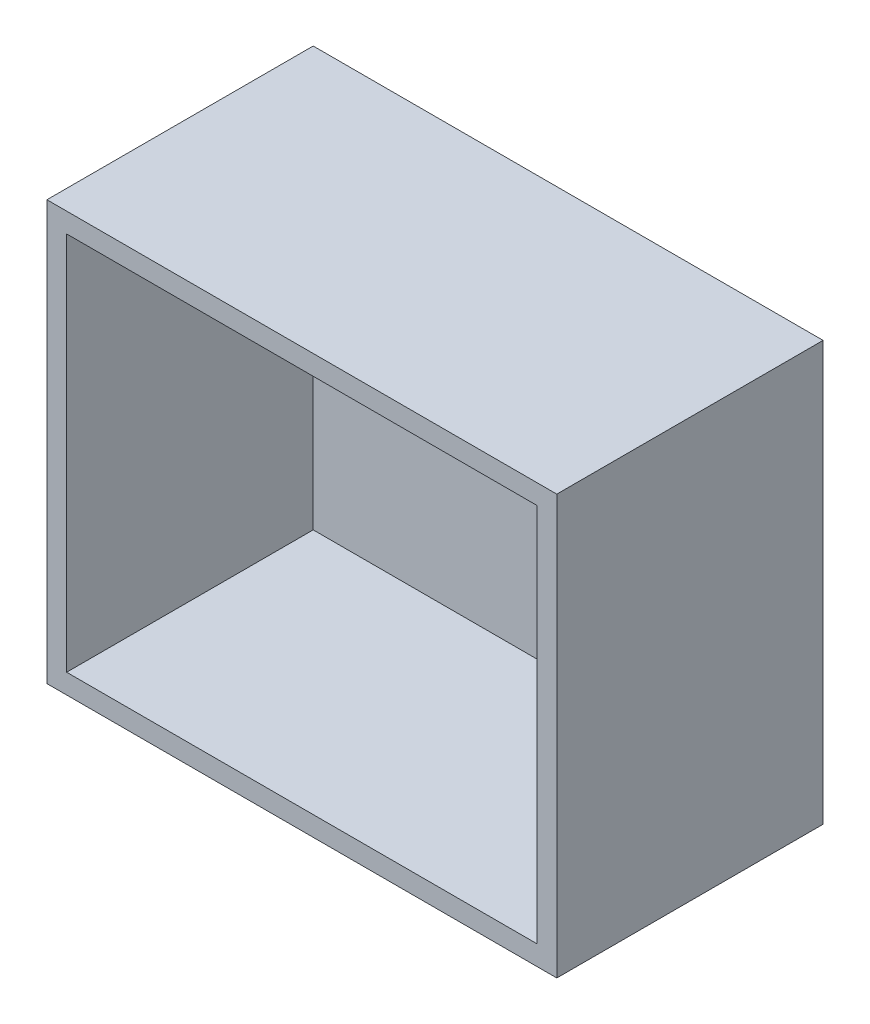
ISO-10303-21;
HEADER;
FILE_DESCRIPTION(('STEP AP214'),'2;1');
FILE_NAME('part.step','',(''),(''),'','','');
FILE_SCHEMA(('AUTOMOTIVE_DESIGN { 1 0 10303 214 1 1 1 1 }'));
ENDSEC;
DATA;
#1=APPLICATION_CONTEXT('core data for automotive mechanical design processes');
#2=APPLICATION_PROTOCOL_DEFINITION('international standard','automotive_design',2000,#1);
#3=PRODUCT_CONTEXT('',#1,'mechanical');
#4=PRODUCT('Part','Part','',(#3));
#5=PRODUCT_RELATED_PRODUCT_CATEGORY('part','',(#4));
#6=PRODUCT_DEFINITION_FORMATION('','',#4);
#7=PRODUCT_DEFINITION_CONTEXT('part definition',#1,'design');
#8=PRODUCT_DEFINITION('design','',#6,#7);
#9=PRODUCT_DEFINITION_SHAPE('','',#8);
#10=(LENGTH_UNIT() NAMED_UNIT(*) SI_UNIT(.MILLI.,.METRE.));
#11=(NAMED_UNIT(*) PLANE_ANGLE_UNIT() SI_UNIT($,.RADIAN.));
#12=(NAMED_UNIT(*) SI_UNIT($,.STERADIAN.) SOLID_ANGLE_UNIT());
#13=UNCERTAINTY_MEASURE_WITH_UNIT(LENGTH_MEASURE(1.E-05),#10,'distance_accuracy_value','');
#14=(GEOMETRIC_REPRESENTATION_CONTEXT(3) GLOBAL_UNCERTAINTY_ASSIGNED_CONTEXT((#13)) GLOBAL_UNIT_ASSIGNED_CONTEXT((#10,
#11,#12)) REPRESENTATION_CONTEXT('',''));
#15=CARTESIAN_POINT('',(0.,0.,0.));
#16=DIRECTION('',(0.,0.,1.));
#17=DIRECTION('',(1.,0.,0.));
#18=AXIS2_PLACEMENT_3D('',#15,#16,#17);
#19=CARTESIAN_POINT('',(-42.3243102365575,40.3763294306909,51.));
#20=DIRECTION('',(0.,0.,-1.));
#21=DIRECTION('',(-1.,0.,0.));
#22=AXIS2_PLACEMENT_3D('',#19,#20,#21);
#23=PLANE('',#22);
#24=DIRECTION('',(1.,0.,0.));
#25=VECTOR('',#24,1.);
#26=CARTESIAN_POINT('',(-42.3243102365575,43.3763294306909,51.));
#27=LINE('',#26,#25);
#28=CARTESIAN_POINT('',(58.0747300567757,43.3763294306909,51.));
#29=VERTEX_POINT('',#28);
#30=CARTESIAN_POINT('',(-45.3243102365575,43.3763294306909,51.));
#31=VERTEX_POINT('',#30);
#32=EDGE_CURVE('E199',#29,#31,#27,.F.);
#33=ORIENTED_EDGE('',*,*,#32,.T.);
#34=DIRECTION('',(0.,1.,0.));
#35=VECTOR('',#34,1.);
#36=CARTESIAN_POINT('',(-45.3243102365575,40.3763294306909,51.));
#37=LINE('',#36,#35);
#38=CARTESIAN_POINT('',(-45.3243102365575,-41.6054377889939,51.));
#39=VERTEX_POINT('',#38);
#40=EDGE_CURVE('E395',#31,#39,#37,.F.);
#41=ORIENTED_EDGE('',*,*,#40,.T.);
#42=DIRECTION('',(-1.,0.,0.));
#43=VECTOR('',#42,1.);
#44=CARTESIAN_POINT('',(-42.3243102365575,-41.6054377889939,51.));
#45=LINE('',#44,#43);
#46=CARTESIAN_POINT('',(58.0747300567757,-41.6054377889939,51.));
#47=VERTEX_POINT('',#46);
#48=EDGE_CURVE('E368',#39,#47,#45,.F.);
#49=ORIENTED_EDGE('',*,*,#48,.T.);
#50=DIRECTION('',(0.,-1.,0.));
#51=VECTOR('',#50,1.);
#52=CARTESIAN_POINT('',(58.0747300567757,40.3763294306909,51.));
#53=LINE('',#52,#51);
#54=EDGE_CURVE('E371',#47,#29,#53,.F.);
#55=ORIENTED_EDGE('',*,*,#54,.T.);
#56=EDGE_LOOP('',(#33,#41,#49,#55));
#57=FACE_BOUND('',#56,.T.);
#58=DIRECTION('',(1.,0.,0.));
#59=VECTOR('',#58,1.);
#60=CARTESIAN_POINT('',(-42.3243102365575,39.3763294306909,51.));
#61=LINE('',#60,#59);
#62=CARTESIAN_POINT('',(54.0747300567757,39.3763294306909,51.));
#63=VERTEX_POINT('',#62);
#64=CARTESIAN_POINT('',(-41.3243102365575,39.3763294306909,51.));
#65=VERTEX_POINT('',#64);
#66=EDGE_CURVE('E191',#63,#65,#61,.F.);
#67=ORIENTED_EDGE('',*,*,#66,.F.);
#68=DIRECTION('',(0.,-1.,0.));
#69=VECTOR('',#68,1.);
#70=CARTESIAN_POINT('',(54.0747300567757,40.3763294306909,51.));
#71=LINE('',#70,#69);
#72=CARTESIAN_POINT('',(54.0747300567757,-37.6054377889939,51.));
#73=VERTEX_POINT('',#72);
#74=EDGE_CURVE('E195',#73,#63,#71,.F.);
#75=ORIENTED_EDGE('',*,*,#74,.F.);
#76=DIRECTION('',(-1.,0.,0.));
#77=VECTOR('',#76,1.);
#78=CARTESIAN_POINT('',(-42.3243102365575,-37.6054377889939,51.));
#79=LINE('',#78,#77);
#80=CARTESIAN_POINT('',(-41.3243102365575,-37.6054377889939,51.));
#81=VERTEX_POINT('',#80);
#82=EDGE_CURVE('E214',#81,#73,#79,.F.);
#83=ORIENTED_EDGE('',*,*,#82,.F.);
#84=DIRECTION('',(0.,1.,0.));
#85=VECTOR('',#84,1.);
#86=CARTESIAN_POINT('',(-41.3243102365575,40.3763294306909,51.));
#87=LINE('',#86,#85);
#88=EDGE_CURVE('E200',#65,#81,#87,.F.);
#89=ORIENTED_EDGE('',*,*,#88,.F.);
#90=EDGE_LOOP('',(#67,#75,#83,#89));
#91=FACE_BOUND('',#90,.T.);
#92=ADVANCED_FACE('F61',(#57,#91),#23,.F.);
#93=CARTESIAN_POINT('',(-45.3243102365575,40.3763294306909,0.));
#94=DIRECTION('',(-1.,0.,0.));
#95=DIRECTION('',(0.,0.,1.));
#96=AXIS2_PLACEMENT_3D('',#93,#94,#95);
#97=PLANE('',#96);
#98=ORIENTED_EDGE('',*,*,#40,.F.);
#99=DIRECTION('',(0.,0.,1.));
#100=VECTOR('',#99,1.);
#101=CARTESIAN_POINT('',(-45.3243102365575,43.3763294306909,0.));
#102=LINE('',#101,#100);
#103=CARTESIAN_POINT('',(-45.3243102365575,43.3763294306909,-3.));
#104=VERTEX_POINT('',#103);
#105=EDGE_CURVE('E339',#104,#31,#102,.T.);
#106=ORIENTED_EDGE('',*,*,#105,.F.);
#107=CARTESIAN_POINT('',(-45.3243102365575,43.3763294306909,-3.));
#108=CARTESIAN_POINT('',(-45.3243102365575,36.4611800878396,-3.));
#109=CARTESIAN_POINT('',(-45.3243102365575,29.5460307449883,-3.));
#110=CARTESIAN_POINT('',(-45.3243102365575,15.7157320592858,-3.));
#111=CARTESIAN_POINT('',(-45.3243102365575,8.80058271643453,-3.));
#112=CARTESIAN_POINT('',(-45.3243102365575,-5.36304515351294,-3.));
#113=CARTESIAN_POINT('',(-45.3243102365575,-12.6115236806091,-3.));
#114=CARTESIAN_POINT('',(-45.3243102365575,-27.1084807348015,-3.));
#115=CARTESIAN_POINT('',(-45.3243102365575,-34.3569592618977,-3.));
#116=CARTESIAN_POINT('',(-45.3243102365575,-41.6054377889939,-3.));
#117=B_SPLINE_CURVE_WITH_KNOTS('',3,(#107,#108,#109,#110,#111,#112,#113,#114,#115,#116),
.UNSPECIFIED.,.F.,.F.,(4,2,2,2,4),(0.,20.7454480285538,41.4908960571076,63.2363316383962,
84.9817672196848),.UNSPECIFIED.);
#118=CARTESIAN_POINT('',(-45.3243102365575,-41.6054377889939,-3.));
#119=VERTEX_POINT('',#118);
#120=EDGE_CURVE('E351',#104,#119,#117,.T.);
#121=ORIENTED_EDGE('',*,*,#120,.T.);
#122=DIRECTION('',(0.,0.,1.));
#123=VECTOR('',#122,1.);
#124=CARTESIAN_POINT('',(-45.3243102365575,-41.6054377889939,0.));
#125=LINE('',#124,#123);
#126=EDGE_CURVE('E394',#119,#39,#125,.T.);
#127=ORIENTED_EDGE('',*,*,#126,.T.);
#128=EDGE_LOOP('',(#98,#106,#121,#127));
#129=FACE_BOUND('',#128,.T.);
#130=ADVANCED_FACE('F322',(#129),#97,.T.);
#131=CARTESIAN_POINT('',(-42.3243102365575,-41.6054377889939,0.));
#132=DIRECTION('',(0.,-1.,0.));
#133=DIRECTION('',(0.,0.,-1.));
#134=AXIS2_PLACEMENT_3D('',#131,#132,#133);
#135=PLANE('',#134);
#136=ORIENTED_EDGE('',*,*,#48,.F.);
#137=ORIENTED_EDGE('',*,*,#126,.F.);
#138=CARTESIAN_POINT('',(-45.3243102365575,-41.6054377889939,-3.));
#139=CARTESIAN_POINT('',(-31.494011550855,-41.6054377889939,-3.));
#140=CARTESIAN_POINT('',(-17.6637128651525,-41.6054377889939,-3.));
#141=CARTESIAN_POINT('',(6.48460985992101,-41.6054377889939,-3.));
#142=CARTESIAN_POINT('',(16.802633899292,-41.6054377889939,-3.));
#143=CARTESIAN_POINT('',(37.4386819780338,-41.6054377889939,-3.));
#144=CARTESIAN_POINT('',(47.7567060174047,-41.6054377889939,-3.));
#145=CARTESIAN_POINT('',(58.0747300567757,-41.6054377889939,-3.));
#146=B_SPLINE_CURVE_WITH_KNOTS('',3,(#138,#139,#140,#141,#142,#143,#144,#145),.UNSPECIFIED.,.F.,
.F.,(4,2,2,4),(0.,41.4908960571076,72.4449681752204,103.399040293333),.UNSPECIFIED.);
#147=CARTESIAN_POINT('',(58.0747300567757,-41.6054377889939,-3.));
#148=VERTEX_POINT('',#147);
#149=EDGE_CURVE('E141',#119,#148,#146,.T.);
#150=ORIENTED_EDGE('',*,*,#149,.T.);
#151=DIRECTION('',(0.,0.,1.));
#152=VECTOR('',#151,1.);
#153=CARTESIAN_POINT('',(58.0747300567757,-41.6054377889939,0.));
#154=LINE('',#153,#152);
#155=EDGE_CURVE('E369',#148,#47,#154,.T.);
#156=ORIENTED_EDGE('',*,*,#155,.T.);
#157=EDGE_LOOP('',(#136,#137,#150,#156));
#158=FACE_BOUND('',#157,.T.);
#159=ADVANCED_FACE('F404',(#158),#135,.T.);
#160=CARTESIAN_POINT('',(58.0747300567757,40.3763294306909,0.));
#161=DIRECTION('',(1.,0.,0.));
#162=DIRECTION('',(0.,0.,-1.));
#163=AXIS2_PLACEMENT_3D('',#160,#161,#162);
#164=PLANE('',#163);
#165=ORIENTED_EDGE('',*,*,#54,.F.);
#166=ORIENTED_EDGE('',*,*,#155,.F.);
#167=CARTESIAN_POINT('',(58.0747300567757,-41.6054377889939,-3.));
#168=CARTESIAN_POINT('',(58.0747300567756,-34.6902884461426,-3.));
#169=CARTESIAN_POINT('',(58.0747300567756,-27.7751391032914,-3.));
#170=CARTESIAN_POINT('',(58.0747300567756,-13.9448404175888,-3.));
#171=CARTESIAN_POINT('',(58.0747300567757,-7.02969107473757,-3.));
#172=CARTESIAN_POINT('',(58.0747300567757,7.13393679520989,-3.));
#173=CARTESIAN_POINT('',(58.0747300567757,14.3824153223061,-3.));
#174=CARTESIAN_POINT('',(58.0747300567757,28.8793723764985,-3.));
#175=CARTESIAN_POINT('',(58.0747300567757,36.1278509035947,-3.));
#176=CARTESIAN_POINT('',(58.0747300567757,43.3763294306909,-3.));
#177=B_SPLINE_CURVE_WITH_KNOTS('',3,(#167,#168,#169,#170,#171,#172,#173,#174,#175,#176),
.UNSPECIFIED.,.F.,.F.,(4,2,2,2,4),(0.,20.7454480285538,41.4908960571076,63.2363316383962,
84.9817672196848),.UNSPECIFIED.);
#178=CARTESIAN_POINT('',(58.0747300567757,43.3763294306909,-3.));
#179=VERTEX_POINT('',#178);
#180=EDGE_CURVE('E363',#148,#179,#177,.T.);
#181=ORIENTED_EDGE('',*,*,#180,.T.);
#182=DIRECTION('',(0.,0.,1.));
#183=VECTOR('',#182,1.);
#184=CARTESIAN_POINT('',(58.0747300567757,43.3763294306909,0.));
#185=LINE('',#184,#183);
#186=EDGE_CURVE('E203',#179,#29,#185,.T.);
#187=ORIENTED_EDGE('',*,*,#186,.T.);
#188=EDGE_LOOP('',(#165,#166,#181,#187));
#189=FACE_BOUND('',#188,.T.);
#190=ADVANCED_FACE('F328',(#189),#164,.T.);
#191=CARTESIAN_POINT('',(-42.3243102365575,43.3763294306909,0.));
#192=DIRECTION('',(0.,1.,0.));
#193=DIRECTION('',(0.,0.,1.));
#194=AXIS2_PLACEMENT_3D('',#191,#192,#193);
#195=PLANE('',#194);
#196=ORIENTED_EDGE('',*,*,#32,.F.);
#197=ORIENTED_EDGE('',*,*,#186,.F.);
#198=CARTESIAN_POINT('',(58.0747300567757,43.3763294306909,-3.));
#199=CARTESIAN_POINT('',(44.2444313710731,43.3763294306909,-3.));
#200=CARTESIAN_POINT('',(30.4141326853706,43.3763294306909,-3.));
#201=CARTESIAN_POINT('',(6.26580996029714,43.3763294306909,-3.));
#202=CARTESIAN_POINT('',(-4.05221407907379,43.3763294306909,-3.));
#203=CARTESIAN_POINT('',(-24.6882621578157,43.3763294306909,-3.));
#204=CARTESIAN_POINT('',(-35.0062861971866,43.3763294306909,-3.));
#205=CARTESIAN_POINT('',(-45.3243102365575,43.3763294306909,-3.));
#206=B_SPLINE_CURVE_WITH_KNOTS('',3,(#198,#199,#200,#201,#202,#203,#204,#205),.UNSPECIFIED.,.F.,
.F.,(4,2,2,4),(0.,41.4908960571076,72.4449681752204,103.399040293333),.UNSPECIFIED.);
#207=EDGE_CURVE('E332',#179,#104,#206,.T.);
#208=ORIENTED_EDGE('',*,*,#207,.T.);
#209=ORIENTED_EDGE('',*,*,#105,.T.);
#210=EDGE_LOOP('',(#196,#197,#208,#209));
#211=FACE_BOUND('',#210,.T.);
#212=ADVANCED_FACE('F324',(#211),#195,.T.);
#213=CARTESIAN_POINT('',(58.088720459709,43.3763294306909,0.));
#214=CARTESIAN_POINT('',(58.088720459709,43.0429960973575,0.));
#215=CARTESIAN_POINT('',(58.088720459709,42.7096627640242,0.));
#216=CARTESIAN_POINT('',(58.088720459709,41.7096627640242,0.));
#217=CARTESIAN_POINT('',(58.088720459709,41.0429960973575,0.));
#218=CARTESIAN_POINT('',(58.088720459709,14.0490736907959,0.));
#219=CARTESIAN_POINT('',(58.088720459709,-12.278182049099,0.));
#220=CARTESIAN_POINT('',(58.088720459709,-39.2721044556606,0.));
#221=CARTESIAN_POINT('',(58.088720459709,-39.9387711223272,0.));
#222=CARTESIAN_POINT('',(58.088720459709,-40.9387711223272,0.));
#223=CARTESIAN_POINT('',(58.088720459709,-41.2721044556606,0.));
#224=CARTESIAN_POINT('',(58.088720459709,-41.6054377889939,0.));
#225=CARTESIAN_POINT('',(57.7507236587312,43.3763294306909,0.));
#226=CARTESIAN_POINT('',(57.7507236587312,43.0429960973575,0.));
#227=CARTESIAN_POINT('',(57.7507236587312,42.7096627640242,0.));
#228=CARTESIAN_POINT('',(57.7507236587312,41.7096627640242,0.));
#229=CARTESIAN_POINT('',(57.7507236587312,41.0429960973575,0.));
#230=CARTESIAN_POINT('',(57.7507236587312,14.0490736907959,0.));
#231=CARTESIAN_POINT('',(57.7507236587312,-12.278182049099,0.));
#232=CARTESIAN_POINT('',(57.7507236587312,-39.2721044556606,0.));
#233=CARTESIAN_POINT('',(57.7507236587312,-39.9387711223272,0.));
#234=CARTESIAN_POINT('',(57.7507236587312,-40.9387711223272,0.));
#235=CARTESIAN_POINT('',(57.7507236587312,-41.2721044556606,0.));
#236=CARTESIAN_POINT('',(57.7507236587312,-41.6054377889939,0.));
#237=CARTESIAN_POINT('',(57.4127268577534,43.3763294306909,0.));
#238=CARTESIAN_POINT('',(57.4127268577534,43.0429960973575,0.));
#239=CARTESIAN_POINT('',(57.4127268577534,42.7096627640242,0.));
#240=CARTESIAN_POINT('',(57.4127268577534,41.7096627640242,0.));
#241=CARTESIAN_POINT('',(57.4127268577534,41.0429960973575,0.));
#242=CARTESIAN_POINT('',(57.4127268577534,14.0490736907959,0.));
#243=CARTESIAN_POINT('',(57.4127268577534,-12.278182049099,0.));
#244=CARTESIAN_POINT('',(57.4127268577534,-39.2721044556606,0.));
#245=CARTESIAN_POINT('',(57.4127268577534,-39.9387711223272,0.));
#246=CARTESIAN_POINT('',(57.4127268577534,-40.9387711223272,0.));
#247=CARTESIAN_POINT('',(57.4127268577534,-41.2721044556606,0.));
#248=CARTESIAN_POINT('',(57.4127268577534,-41.6054377889939,0.));
#249=CARTESIAN_POINT('',(56.408063390109,43.3763294306909,0.));
#250=CARTESIAN_POINT('',(56.408063390109,43.0429960973575,0.));
#251=CARTESIAN_POINT('',(56.408063390109,42.7096627640242,0.));
#252=CARTESIAN_POINT('',(56.408063390109,41.7096627640242,0.));
#253=CARTESIAN_POINT('',(56.408063390109,41.0429960973575,0.));
#254=CARTESIAN_POINT('',(56.408063390109,14.0490736907959,0.));
#255=CARTESIAN_POINT('',(56.408063390109,-12.278182049099,0.));
#256=CARTESIAN_POINT('',(56.408063390109,-39.2721044556606,0.));
#257=CARTESIAN_POINT('',(56.408063390109,-39.9387711223272,0.));
#258=CARTESIAN_POINT('',(56.408063390109,-40.9387711223272,0.));
#259=CARTESIAN_POINT('',(56.408063390109,-41.2721044556606,0.));
#260=CARTESIAN_POINT('',(56.408063390109,-41.6054377889939,0.));
#261=CARTESIAN_POINT('',(55.7413967234423,43.3763294306909,0.));
#262=CARTESIAN_POINT('',(55.7413967234423,43.0429960973575,0.));
#263=CARTESIAN_POINT('',(55.7413967234423,42.7096627640242,0.));
#264=CARTESIAN_POINT('',(55.7413967234423,41.7096627640242,0.));
#265=CARTESIAN_POINT('',(55.7413967234423,41.0429960973575,0.));
#266=CARTESIAN_POINT('',(55.7413967234423,14.0490736907959,0.));
#267=CARTESIAN_POINT('',(55.7413967234423,-12.278182049099,0.));
#268=CARTESIAN_POINT('',(55.7413967234423,-39.2721044556606,0.));
#269=CARTESIAN_POINT('',(55.7413967234423,-39.9387711223272,0.));
#270=CARTESIAN_POINT('',(55.7413967234423,-40.9387711223272,0.));
#271=CARTESIAN_POINT('',(55.7413967234423,-41.2721044556606,0.));
#272=CARTESIAN_POINT('',(55.7413967234423,-41.6054377889939,0.));
#273=CARTESIAN_POINT('',(22.6083832923313,43.3763294306909,0.));
#274=CARTESIAN_POINT('',(22.6083832923313,43.0429960973575,0.));
#275=CARTESIAN_POINT('',(22.6083832923313,42.7096627640242,0.));
#276=CARTESIAN_POINT('',(22.6083832923313,41.7096627640242,0.));
#277=CARTESIAN_POINT('',(22.6083832923313,41.0429960973575,0.));
#278=CARTESIAN_POINT('',(22.6083832923313,14.0490736907959,0.));
#279=CARTESIAN_POINT('',(22.6083832923313,-12.278182049099,0.));
#280=CARTESIAN_POINT('',(22.6083832923313,-39.2721044556606,0.));
#281=CARTESIAN_POINT('',(22.6083832923313,-39.9387711223272,0.));
#282=CARTESIAN_POINT('',(22.6083832923313,-40.9387711223272,0.));
#283=CARTESIAN_POINT('',(22.6083832923313,-41.2721044556606,0.));
#284=CARTESIAN_POINT('',(22.6083832923313,-41.6054377889939,0.));
#285=CARTESIAN_POINT('',(-9.85796347211313,43.3763294306909,0.));
#286=CARTESIAN_POINT('',(-9.85796347211313,43.0429960973575,0.));
#287=CARTESIAN_POINT('',(-9.85796347211313,42.7096627640242,0.));
#288=CARTESIAN_POINT('',(-9.85796347211313,41.7096627640242,0.));
#289=CARTESIAN_POINT('',(-9.85796347211313,41.0429960973575,0.));
#290=CARTESIAN_POINT('',(-9.85796347211313,14.0490736907959,0.));
#291=CARTESIAN_POINT('',(-9.85796347211313,-12.278182049099,0.));
#292=CARTESIAN_POINT('',(-9.85796347211313,-39.2721044556606,0.));
#293=CARTESIAN_POINT('',(-9.85796347211313,-39.9387711223272,0.));
#294=CARTESIAN_POINT('',(-9.85796347211313,-40.9387711223272,0.));
#295=CARTESIAN_POINT('',(-9.85796347211313,-41.2721044556606,0.));
#296=CARTESIAN_POINT('',(-9.85796347211313,-41.6054377889939,0.));
#297=CARTESIAN_POINT('',(-42.9909769032242,43.3763294306909,0.));
#298=CARTESIAN_POINT('',(-42.9909769032242,43.0429960973575,0.));
#299=CARTESIAN_POINT('',(-42.9909769032242,42.7096627640242,0.));
#300=CARTESIAN_POINT('',(-42.9909769032242,41.7096627640242,0.));
#301=CARTESIAN_POINT('',(-42.9909769032242,41.0429960973575,0.));
#302=CARTESIAN_POINT('',(-42.9909769032242,14.0490736907959,0.));
#303=CARTESIAN_POINT('',(-42.9909769032242,-12.278182049099,0.));
#304=CARTESIAN_POINT('',(-42.9909769032242,-39.2721044556606,0.));
#305=CARTESIAN_POINT('',(-42.9909769032242,-39.9387711223272,0.));
#306=CARTESIAN_POINT('',(-42.9909769032242,-40.9387711223272,0.));
#307=CARTESIAN_POINT('',(-42.9909769032242,-41.2721044556606,0.));
#308=CARTESIAN_POINT('',(-42.9909769032242,-41.6054377889939,0.));
#309=CARTESIAN_POINT('',(-43.6576435698909,43.3763294306909,0.));
#310=CARTESIAN_POINT('',(-43.6576435698909,43.0429960973575,0.));
#311=CARTESIAN_POINT('',(-43.6576435698909,42.7096627640242,0.));
#312=CARTESIAN_POINT('',(-43.6576435698909,41.7096627640242,0.));
#313=CARTESIAN_POINT('',(-43.6576435698909,41.0429960973575,0.));
#314=CARTESIAN_POINT('',(-43.6576435698909,14.0490736907959,0.));
#315=CARTESIAN_POINT('',(-43.6576435698909,-12.278182049099,0.));
#316=CARTESIAN_POINT('',(-43.6576435698909,-39.2721044556606,0.));
#317=CARTESIAN_POINT('',(-43.6576435698909,-39.9387711223272,0.));
#318=CARTESIAN_POINT('',(-43.6576435698909,-40.9387711223272,0.));
#319=CARTESIAN_POINT('',(-43.6576435698909,-41.2721044556606,0.));
#320=CARTESIAN_POINT('',(-43.6576435698909,-41.6054377889939,0.));
#321=CARTESIAN_POINT('',(-44.6623070375353,43.3763294306909,0.));
#322=CARTESIAN_POINT('',(-44.6623070375353,43.0429960973575,0.));
#323=CARTESIAN_POINT('',(-44.6623070375353,42.7096627640242,0.));
#324=CARTESIAN_POINT('',(-44.6623070375353,41.7096627640242,0.));
#325=CARTESIAN_POINT('',(-44.6623070375353,41.0429960973575,0.));
#326=CARTESIAN_POINT('',(-44.6623070375353,14.0490736907959,0.));
#327=CARTESIAN_POINT('',(-44.6623070375353,-12.278182049099,0.));
#328=CARTESIAN_POINT('',(-44.6623070375353,-39.2721044556606,0.));
#329=CARTESIAN_POINT('',(-44.6623070375353,-39.9387711223272,0.));
#330=CARTESIAN_POINT('',(-44.6623070375353,-40.9387711223272,0.));
#331=CARTESIAN_POINT('',(-44.6623070375353,-41.2721044556606,0.));
#332=CARTESIAN_POINT('',(-44.6623070375353,-41.6054377889939,0.));
#333=CARTESIAN_POINT('',(-45.0003038385131,43.3763294306909,0.));
#334=CARTESIAN_POINT('',(-45.0003038385131,43.0429960973575,0.));
#335=CARTESIAN_POINT('',(-45.0003038385131,42.7096627640242,0.));
#336=CARTESIAN_POINT('',(-45.0003038385131,41.7096627640242,0.));
#337=CARTESIAN_POINT('',(-45.0003038385131,41.0429960973575,0.));
#338=CARTESIAN_POINT('',(-45.0003038385131,14.0490736907959,0.));
#339=CARTESIAN_POINT('',(-45.0003038385131,-12.278182049099,0.));
#340=CARTESIAN_POINT('',(-45.0003038385131,-39.2721044556606,0.));
#341=CARTESIAN_POINT('',(-45.0003038385131,-39.9387711223272,0.));
#342=CARTESIAN_POINT('',(-45.0003038385131,-40.9387711223272,0.));
#343=CARTESIAN_POINT('',(-45.0003038385131,-41.2721044556606,0.));
#344=CARTESIAN_POINT('',(-45.0003038385131,-41.6054377889939,0.));
#345=CARTESIAN_POINT('',(-45.3383006394909,43.3763294306909,0.));
#346=CARTESIAN_POINT('',(-45.3383006394909,43.0429960973575,0.));
#347=CARTESIAN_POINT('',(-45.3383006394909,42.7096627640242,0.));
#348=CARTESIAN_POINT('',(-45.3383006394909,41.7096627640242,0.));
#349=CARTESIAN_POINT('',(-45.3383006394909,41.0429960973575,0.));
#350=CARTESIAN_POINT('',(-45.3383006394909,14.0490736907959,0.));
#351=CARTESIAN_POINT('',(-45.3383006394909,-12.278182049099,0.));
#352=CARTESIAN_POINT('',(-45.3383006394909,-39.2721044556606,0.));
#353=CARTESIAN_POINT('',(-45.3383006394909,-39.9387711223272,0.));
#354=CARTESIAN_POINT('',(-45.3383006394909,-40.9387711223272,0.));
#355=CARTESIAN_POINT('',(-45.3383006394909,-41.2721044556606,0.));
#356=CARTESIAN_POINT('',(-45.3383006394909,-41.6054377889939,0.));
#357=B_SPLINE_SURFACE_WITH_KNOTS('',3,3,((#213,#214,#215,#216,#217,#218,#219,#220,#221,#222,
#223,#224),(#225,#226,#227,#228,#229,#230,#231,#232,#233,#234,#235,#236),(#237,#238,#239,#240,
#241,#242,#243,#244,#245,#246,#247,#248),(#249,#250,#251,#252,#253,#254,#255,#256,#257,#258,
#259,#260),(#261,#262,#263,#264,#265,#266,#267,#268,#269,#270,#271,#272),(#273,#274,#275,#276,
#277,#278,#279,#280,#281,#282,#283,#284),(#285,#286,#287,#288,#289,#290,#291,#292,#293,#294,
#295,#296),(#297,#298,#299,#300,#301,#302,#303,#304,#305,#306,#307,#308),(#309,#310,#311,#312,
#313,#314,#315,#316,#317,#318,#319,#320),(#321,#322,#323,#324,#325,#326,#327,#328,#329,#330,
#331,#332),(#333,#334,#335,#336,#337,#338,#339,#340,#341,#342,#343,#344),(#345,#346,#347,#348,
#349,#350,#351,#352,#353,#354,#355,#356)),.UNSPECIFIED.,.F.,.F.,.F.,(4,2,2,2,2,4),(4,2,2,2,2,4),
(-0.0309447648955904,-0.020534083230971,0.,1.,1.02053408323097,1.03094476489559),
(-0.0379834499227601,-0.0253222999485068,0.,1.,1.02532229994851,1.03798344992276),.UNSPECIFIED.);
#358=OFFSET_SURFACE('',#357,-3.,.F.);
#359=ORIENTED_EDGE('',*,*,#207,.F.);
#360=ORIENTED_EDGE('',*,*,#180,.F.);
#361=ORIENTED_EDGE('',*,*,#149,.F.);
#362=ORIENTED_EDGE('',*,*,#120,.F.);
#363=EDGE_LOOP('',(#359,#360,#361,#362));
#364=FACE_BOUND('',#363,.T.);
#365=ADVANCED_FACE('F319',(#364),#358,.F.);
#366=CARTESIAN_POINT('',(-41.3243102365575,40.3763294306909,0.));
#367=DIRECTION('',(-1.,0.,0.));
#368=DIRECTION('',(0.,0.,1.));
#369=AXIS2_PLACEMENT_3D('',#366,#367,#368);
#370=PLANE('',#369);
#371=ORIENTED_EDGE('',*,*,#88,.T.);
#372=DIRECTION('',(0.,0.,1.));
#373=VECTOR('',#372,1.);
#374=CARTESIAN_POINT('',(-41.3243102365575,-37.6054377889939,0.));
#375=LINE('',#374,#373);
#376=CARTESIAN_POINT('',(-41.3243102365575,-37.6054377889939,1.));
#377=VERTEX_POINT('',#376);
#378=EDGE_CURVE('E198',#377,#81,#375,.T.);
#379=ORIENTED_EDGE('',*,*,#378,.F.);
#380=DIRECTION('',(0.,-1.,0.));
#381=VECTOR('',#380,1.);
#382=CARTESIAN_POINT('',(-41.3243102365575,40.3763294306909,1.));
#383=LINE('',#382,#381);
#384=CARTESIAN_POINT('',(-41.3243102365575,39.3763294306909,1.));
#385=VERTEX_POINT('',#384);
#386=EDGE_CURVE('E181',#385,#377,#383,.T.);
#387=ORIENTED_EDGE('',*,*,#386,.F.);
#388=DIRECTION('',(0.,0.,1.));
#389=VECTOR('',#388,1.);
#390=CARTESIAN_POINT('',(-41.3243102365575,39.3763294306909,0.));
#391=LINE('',#390,#389);
#392=EDGE_CURVE('E185',#385,#65,#391,.T.);
#393=ORIENTED_EDGE('',*,*,#392,.T.);
#394=EDGE_LOOP('',(#371,#379,#387,#393));
#395=FACE_BOUND('',#394,.T.);
#396=ADVANCED_FACE('F197',(#395),#370,.F.);
#397=CARTESIAN_POINT('',(-42.3243102365575,-37.6054377889939,0.));
#398=DIRECTION('',(0.,-1.,0.));
#399=DIRECTION('',(0.,0.,-1.));
#400=AXIS2_PLACEMENT_3D('',#397,#398,#399);
#401=PLANE('',#400);
#402=ORIENTED_EDGE('',*,*,#82,.T.);
#403=DIRECTION('',(0.,0.,1.));
#404=VECTOR('',#403,1.);
#405=CARTESIAN_POINT('',(54.0747300567757,-37.6054377889939,0.));
#406=LINE('',#405,#404);
#407=CARTESIAN_POINT('',(54.0747300567757,-37.6054377889939,1.));
#408=VERTEX_POINT('',#407);
#409=EDGE_CURVE('E210',#408,#73,#406,.T.);
#410=ORIENTED_EDGE('',*,*,#409,.F.);
#411=DIRECTION('',(1.,0.,0.));
#412=VECTOR('',#411,1.);
#413=CARTESIAN_POINT('',(55.0747300567757,-37.6054377889939,1.));
#414=LINE('',#413,#412);
#415=EDGE_CURVE('E205',#377,#408,#414,.T.);
#416=ORIENTED_EDGE('',*,*,#415,.F.);
#417=ORIENTED_EDGE('',*,*,#378,.T.);
#418=EDGE_LOOP('',(#402,#410,#416,#417));
#419=FACE_BOUND('',#418,.T.);
#420=ADVANCED_FACE('F312',(#419),#401,.F.);
#421=CARTESIAN_POINT('',(54.0747300567757,40.3763294306909,0.));
#422=DIRECTION('',(1.,0.,0.));
#423=DIRECTION('',(0.,0.,-1.));
#424=AXIS2_PLACEMENT_3D('',#421,#422,#423);
#425=PLANE('',#424);
#426=ORIENTED_EDGE('',*,*,#74,.T.);
#427=DIRECTION('',(0.,0.,1.));
#428=VECTOR('',#427,1.);
#429=CARTESIAN_POINT('',(54.0747300567757,39.3763294306909,0.));
#430=LINE('',#429,#428);
#431=CARTESIAN_POINT('',(54.0747300567757,39.3763294306909,1.));
#432=VERTEX_POINT('',#431);
#433=EDGE_CURVE('E186',#432,#63,#430,.T.);
#434=ORIENTED_EDGE('',*,*,#433,.F.);
#435=DIRECTION('',(0.,1.,0.));
#436=VECTOR('',#435,1.);
#437=CARTESIAN_POINT('',(54.0747300567757,40.3763294306909,1.));
#438=LINE('',#437,#436);
#439=EDGE_CURVE('E183',#408,#432,#438,.T.);
#440=ORIENTED_EDGE('',*,*,#439,.F.);
#441=ORIENTED_EDGE('',*,*,#409,.T.);
#442=EDGE_LOOP('',(#426,#434,#440,#441));
#443=FACE_BOUND('',#442,.T.);
#444=ADVANCED_FACE('F309',(#443),#425,.F.);
#445=CARTESIAN_POINT('',(-42.3243102365575,39.3763294306909,0.));
#446=DIRECTION('',(0.,1.,0.));
#447=DIRECTION('',(0.,0.,1.));
#448=AXIS2_PLACEMENT_3D('',#445,#446,#447);
#449=PLANE('',#448);
#450=ORIENTED_EDGE('',*,*,#66,.T.);
#451=ORIENTED_EDGE('',*,*,#392,.F.);
#452=DIRECTION('',(-1.,0.,0.));
#453=VECTOR('',#452,1.);
#454=CARTESIAN_POINT('',(55.0747300567757,39.3763294306909,1.));
#455=LINE('',#454,#453);
#456=EDGE_CURVE('E174',#432,#385,#455,.T.);
#457=ORIENTED_EDGE('',*,*,#456,.F.);
#458=ORIENTED_EDGE('',*,*,#433,.T.);
#459=EDGE_LOOP('',(#450,#451,#457,#458));
#460=FACE_BOUND('',#459,.T.);
#461=ADVANCED_FACE('F189',(#460),#449,.F.);
#462=CARTESIAN_POINT('',(55.0747300567757,40.3763294306909,1.));
#463=DIRECTION('',(0.,0.,1.));
#464=DIRECTION('',(-1.,0.,0.));
#465=AXIS2_PLACEMENT_3D('',#462,#463,#464);
#466=PLANE('',#465);
#467=ORIENTED_EDGE('',*,*,#456,.T.);
#468=ORIENTED_EDGE('',*,*,#386,.T.);
#469=ORIENTED_EDGE('',*,*,#415,.T.);
#470=ORIENTED_EDGE('',*,*,#439,.T.);
#471=EDGE_LOOP('',(#467,#468,#469,#470));
#472=FACE_BOUND('',#471,.T.);
#473=ADVANCED_FACE('F178',(#472),#466,.T.);
#474=CLOSED_SHELL('',(#92,#130,#159,#190,#212,#365,#396,#420,#444,#461,#473));
#475=CARTESIAN_POINT('',(-42.3243102365575,40.3763294306909,50.));
#476=DIRECTION('',(0.,0.,-1.));
#477=DIRECTION('',(-1.,0.,0.));
#478=AXIS2_PLACEMENT_3D('',#475,#476,#477);
#479=PLANE('',#478);
#480=DIRECTION('',(1.,0.,0.));
#481=VECTOR('',#480,1.);
#482=CARTESIAN_POINT('',(-42.3243102365575,42.3763294306909,50.));
#483=LINE('',#482,#481);
#484=CARTESIAN_POINT('',(57.0747300567757,42.3763294306909,50.));
#485=VERTEX_POINT('',#484);
#486=CARTESIAN_POINT('',(-44.3243102365575,42.3763294306909,50.));
#487=VERTEX_POINT('',#486);
#488=EDGE_CURVE('E65',#485,#487,#483,.F.);
#489=ORIENTED_EDGE('',*,*,#488,.F.);
#490=DIRECTION('',(0.,1.,0.));
#491=VECTOR('',#490,1.);
#492=CARTESIAN_POINT('',(57.0747300567757,40.3763294306909,50.));
#493=LINE('',#492,#491);
#494=CARTESIAN_POINT('',(57.0747300567757,-40.6054377889939,50.));
#495=VERTEX_POINT('',#494);
#496=EDGE_CURVE('E295',#495,#485,#493,.T.);
#497=ORIENTED_EDGE('',*,*,#496,.F.);
#498=DIRECTION('',(1.,0.,0.));
#499=VECTOR('',#498,1.);
#500=CARTESIAN_POINT('',(-42.3243102365575,-40.6054377889939,50.));
#501=LINE('',#500,#499);
#502=CARTESIAN_POINT('',(-44.3243102365575,-40.6054377889939,50.));
#503=VERTEX_POINT('',#502);
#504=EDGE_CURVE('E127',#503,#495,#501,.T.);
#505=ORIENTED_EDGE('',*,*,#504,.F.);
#506=DIRECTION('',(0.,1.,0.));
#507=VECTOR('',#506,1.);
#508=CARTESIAN_POINT('',(-44.3243102365575,40.3763294306909,50.));
#509=LINE('',#508,#507);
#510=EDGE_CURVE('E607',#487,#503,#509,.F.);
#511=ORIENTED_EDGE('',*,*,#510,.F.);
#512=EDGE_LOOP('',(#489,#497,#505,#511));
#513=FACE_BOUND('',#512,.T.);
#514=DIRECTION('',(-1.,0.,0.));
#515=VECTOR('',#514,1.);
#516=CARTESIAN_POINT('',(-42.3243102365575,40.3763294306909,50.));
#517=LINE('',#516,#515);
#518=CARTESIAN_POINT('',(55.0747300567757,40.3763294306909,50.));
#519=VERTEX_POINT('',#518);
#520=CARTESIAN_POINT('',(-42.3243102365575,40.3763294306909,50.));
#521=VERTEX_POINT('',#520);
#522=EDGE_CURVE('E224',#519,#521,#517,.T.);
#523=ORIENTED_EDGE('',*,*,#522,.T.);
#524=DIRECTION('',(0.,-1.,0.));
#525=VECTOR('',#524,1.);
#526=CARTESIAN_POINT('',(-42.3243102365575,40.3763294306909,50.));
#527=LINE('',#526,#525);
#528=CARTESIAN_POINT('',(-42.3243102365575,-38.6054377889939,50.));
#529=VERTEX_POINT('',#528);
#530=EDGE_CURVE('E239',#521,#529,#527,.T.);
#531=ORIENTED_EDGE('',*,*,#530,.T.);
#532=DIRECTION('',(1.,0.,0.));
#533=VECTOR('',#532,1.);
#534=CARTESIAN_POINT('',(-42.3243102365575,-38.6054377889939,50.));
#535=LINE('',#534,#533);
#536=CARTESIAN_POINT('',(55.0747300567757,-38.6054377889939,50.));
#537=VERTEX_POINT('',#536);
#538=EDGE_CURVE('E234',#529,#537,#535,.T.);
#539=ORIENTED_EDGE('',*,*,#538,.T.);
#540=DIRECTION('',(0.,1.,0.));
#541=VECTOR('',#540,1.);
#542=CARTESIAN_POINT('',(55.0747300567757,40.3763294306909,50.));
#543=LINE('',#542,#541);
#544=EDGE_CURVE('E229',#537,#519,#543,.T.);
#545=ORIENTED_EDGE('',*,*,#544,.T.);
#546=EDGE_LOOP('',(#523,#531,#539,#545));
#547=FACE_BOUND('',#546,.T.);
#548=ADVANCED_FACE('F301',(#513,#547),#479,.T.);
#549=CARTESIAN_POINT('',(-44.3243102365575,40.3763294306909,0.));
#550=DIRECTION('',(-1.,0.,0.));
#551=DIRECTION('',(0.,0.,1.));
#552=AXIS2_PLACEMENT_3D('',#549,#550,#551);
#553=PLANE('',#552);
#554=ORIENTED_EDGE('',*,*,#510,.T.);
#555=DIRECTION('',(0.,0.,1.));
#556=VECTOR('',#555,1.);
#557=CARTESIAN_POINT('',(-44.3243102365575,-40.6054377889939,0.));
#558=LINE('',#557,#556);
#559=CARTESIAN_POINT('',(-44.3243102365575,-40.6054377889939,-2.));
#560=VERTEX_POINT('',#559);
#561=EDGE_CURVE('E286',#560,#503,#558,.T.);
#562=ORIENTED_EDGE('',*,*,#561,.F.);
#563=CARTESIAN_POINT('',(-44.3243102365575,42.3763294306909,-2.));
#564=CARTESIAN_POINT('',(-44.3243102365575,35.7945141793544,-2.));
#565=CARTESIAN_POINT('',(-44.3243102365575,29.2126989280178,-2.));
#566=CARTESIAN_POINT('',(-44.3243102365575,16.0490684253448,-2.));
#567=CARTESIAN_POINT('',(-44.3243102365575,9.46725317400828,-2.));
#568=CARTESIAN_POINT('',(-44.3243102365576,-4.36304136260584,-2.));
#569=CARTESIAN_POINT('',(-44.3243102365575,-11.6115206478834,-2.));
#570=CARTESIAN_POINT('',(-44.3243102365575,-26.1084792184387,-2.));
#571=CARTESIAN_POINT('',(-44.3243102365575,-33.3569585037163,-2.));
#572=CARTESIAN_POINT('',(-44.3243102365575,-40.6054377889939,-2.));
#573=B_SPLINE_CURVE_WITH_KNOTS('',3,(#563,#564,#565,#566,#567,#568,#569,#570,#571,#572),
.UNSPECIFIED.,.F.,.F.,(4,2,2,2,4),(0.,19.7454457540095,39.4908915080191,61.2363293638519,
82.9817672196848),.UNSPECIFIED.);
#574=CARTESIAN_POINT('',(-44.3243102365575,42.3763294306909,-2.));
#575=VERTEX_POINT('',#574);
#576=EDGE_CURVE('E289',#575,#560,#573,.T.);
#577=ORIENTED_EDGE('',*,*,#576,.F.);
#578=DIRECTION('',(0.,0.,1.));
#579=VECTOR('',#578,1.);
#580=CARTESIAN_POINT('',(-44.3243102365575,42.3763294306909,0.));
#581=LINE('',#580,#579);
#582=EDGE_CURVE('E242',#575,#487,#581,.T.);
#583=ORIENTED_EDGE('',*,*,#582,.T.);
#584=EDGE_LOOP('',(#554,#562,#577,#583));
#585=FACE_BOUND('',#584,.T.);
#586=ADVANCED_FACE('F297',(#585),#553,.F.);
#587=CARTESIAN_POINT('',(-42.3243102365575,-40.6054377889939,0.));
#588=DIRECTION('',(0.,-1.,0.));
#589=DIRECTION('',(0.,0.,-1.));
#590=AXIS2_PLACEMENT_3D('',#587,#588,#589);
#591=PLANE('',#590);
#592=ORIENTED_EDGE('',*,*,#504,.T.);
#593=DIRECTION('',(0.,0.,1.));
#594=VECTOR('',#593,1.);
#595=CARTESIAN_POINT('',(57.0747300567757,-40.6054377889939,0.));
#596=LINE('',#595,#594);
#597=CARTESIAN_POINT('',(57.0747300567757,-40.6054377889939,-2.));
#598=VERTEX_POINT('',#597);
#599=EDGE_CURVE('E277',#598,#495,#596,.T.);
#600=ORIENTED_EDGE('',*,*,#599,.F.);
#601=CARTESIAN_POINT('',(-44.3243102365575,-40.6054377889939,-2.));
#602=CARTESIAN_POINT('',(-31.1606797338845,-40.6054377889939,-2.));
#603=CARTESIAN_POINT('',(-17.9970492312115,-40.6054377889939,-2.));
#604=CARTESIAN_POINT('',(5.4846060690139,-40.6054377889939,-2.));
#605=CARTESIAN_POINT('',(15.8026308665663,-40.6054377889939,-2.));
#606=CARTESIAN_POINT('',(36.438680461671,-40.6054377889939,-2.));
#607=CARTESIAN_POINT('',(46.7567052592233,-40.6054377889939,-2.));
#608=CARTESIAN_POINT('',(57.0747300567757,-40.6054377889939,-2.));
#609=B_SPLINE_CURVE_WITH_KNOTS('',3,(#601,#602,#603,#604,#605,#606,#607,#608),.UNSPECIFIED.,.F.,
.F.,(4,2,2,4),(0.,39.4908915080191,70.4449659006761,101.399040293333),.UNSPECIFIED.);
#610=EDGE_CURVE('E280',#560,#598,#609,.T.);
#611=ORIENTED_EDGE('',*,*,#610,.F.);
#612=ORIENTED_EDGE('',*,*,#561,.T.);
#613=EDGE_LOOP('',(#592,#600,#611,#612));
#614=FACE_BOUND('',#613,.T.);
#615=ADVANCED_FACE('F267',(#614),#591,.F.);
#616=CARTESIAN_POINT('',(57.0747300567757,40.3763294306909,0.));
#617=DIRECTION('',(1.,0.,0.));
#618=DIRECTION('',(0.,0.,-1.));
#619=AXIS2_PLACEMENT_3D('',#616,#617,#618);
#620=PLANE('',#619);
#621=ORIENTED_EDGE('',*,*,#496,.T.);
#622=DIRECTION('',(0.,0.,1.));
#623=VECTOR('',#622,1.);
#624=CARTESIAN_POINT('',(57.0747300567757,42.3763294306909,0.));
#625=LINE('',#624,#623);
#626=CARTESIAN_POINT('',(57.0747300567757,42.3763294306909,-2.));
#627=VERTEX_POINT('',#626);
#628=EDGE_CURVE('E253',#627,#485,#625,.T.);
#629=ORIENTED_EDGE('',*,*,#628,.F.);
#630=CARTESIAN_POINT('',(57.0747300567757,-40.6054377889939,-2.));
#631=CARTESIAN_POINT('',(57.0747300567757,-34.0236225376574,-2.));
#632=CARTESIAN_POINT('',(57.0747300567757,-27.4418072863209,-2.));
#633=CARTESIAN_POINT('',(57.0747300567757,-14.2781767836478,-2.));
#634=CARTESIAN_POINT('',(57.0747300567757,-7.69636153231132,-2.));
#635=CARTESIAN_POINT('',(57.0747300567757,6.13393300430281,-2.));
#636=CARTESIAN_POINT('',(57.0747300567757,13.3824122895804,-2.));
#637=CARTESIAN_POINT('',(57.0747300567757,27.8793708601356,-2.));
#638=CARTESIAN_POINT('',(57.0747300567757,35.1278501454133,-2.));
#639=CARTESIAN_POINT('',(57.0747300567757,42.3763294306909,-2.));
#640=B_SPLINE_CURVE_WITH_KNOTS('',3,(#630,#631,#632,#633,#634,#635,#636,#637,#638,#639),
.UNSPECIFIED.,.F.,.F.,(4,2,2,2,4),(0.,19.7454457540095,39.4908915080191,61.2363293638519,
82.9817672196848),.UNSPECIFIED.);
#641=EDGE_CURVE('E271',#598,#627,#640,.T.);
#642=ORIENTED_EDGE('',*,*,#641,.F.);
#643=ORIENTED_EDGE('',*,*,#599,.T.);
#644=EDGE_LOOP('',(#621,#629,#642,#643));
#645=FACE_BOUND('',#644,.T.);
#646=ADVANCED_FACE('F262',(#645),#620,.F.);
#647=CARTESIAN_POINT('',(-42.3243102365575,42.3763294306909,0.));
#648=DIRECTION('',(0.,1.,0.));
#649=DIRECTION('',(0.,0.,1.));
#650=AXIS2_PLACEMENT_3D('',#647,#648,#649);
#651=PLANE('',#650);
#652=ORIENTED_EDGE('',*,*,#488,.T.);
#653=ORIENTED_EDGE('',*,*,#582,.F.);
#654=CARTESIAN_POINT('',(57.0747300567757,42.3763294306909,-2.));
#655=CARTESIAN_POINT('',(43.9110995541026,42.3763294306909,-2.));
#656=CARTESIAN_POINT('',(30.7474690514296,42.3763294306909,-2.));
#657=CARTESIAN_POINT('',(7.26581375120422,42.3763294306909,-2.));
#658=CARTESIAN_POINT('',(-3.05221104634813,42.3763294306909,-2.));
#659=CARTESIAN_POINT('',(-23.6882606414528,42.3763294306909,-2.));
#660=CARTESIAN_POINT('',(-34.0062854390052,42.3763294306909,-2.));
#661=CARTESIAN_POINT('',(-44.3243102365575,42.3763294306909,-2.));
#662=B_SPLINE_CURVE_WITH_KNOTS('',3,(#654,#655,#656,#657,#658,#659,#660,#661),.UNSPECIFIED.,.F.,
.F.,(4,2,2,4),(0.,39.4908915080191,70.4449659006761,101.399040293333),.UNSPECIFIED.);
#663=EDGE_CURVE('E245',#627,#575,#662,.T.);
#664=ORIENTED_EDGE('',*,*,#663,.F.);
#665=ORIENTED_EDGE('',*,*,#628,.T.);
#666=EDGE_LOOP('',(#652,#653,#664,#665));
#667=FACE_BOUND('',#666,.T.);
#668=ADVANCED_FACE('F258',(#667),#651,.F.);
#669=CARTESIAN_POINT('',(57.0747300567757,42.3763294306909,0.));
#670=CARTESIAN_POINT('',(57.0747300567757,41.7096627640242,0.));
#671=CARTESIAN_POINT('',(57.0747300567757,41.0429960973575,0.));
#672=CARTESIAN_POINT('',(57.0747300567757,14.0490736907959,0.));
#673=CARTESIAN_POINT('',(57.0747300567757,-12.278182049099,0.));
#674=CARTESIAN_POINT('',(57.0747300567757,-39.2721044556606,0.));
#675=CARTESIAN_POINT('',(57.0747300567757,-39.9387711223272,0.));
#676=CARTESIAN_POINT('',(57.0747300567757,-40.6054377889939,0.));
#677=CARTESIAN_POINT('',(56.408063390109,42.3763294306909,0.));
#678=CARTESIAN_POINT('',(56.408063390109,41.7096627640242,0.));
#679=CARTESIAN_POINT('',(56.408063390109,41.0429960973575,0.));
#680=CARTESIAN_POINT('',(56.408063390109,14.0490736907959,0.));
#681=CARTESIAN_POINT('',(56.408063390109,-12.278182049099,0.));
#682=CARTESIAN_POINT('',(56.408063390109,-39.2721044556606,0.));
#683=CARTESIAN_POINT('',(56.408063390109,-39.9387711223272,0.));
#684=CARTESIAN_POINT('',(56.408063390109,-40.6054377889939,0.));
#685=CARTESIAN_POINT('',(55.7413967234423,42.3763294306909,0.));
#686=CARTESIAN_POINT('',(55.7413967234423,41.7096627640242,0.));
#687=CARTESIAN_POINT('',(55.7413967234423,41.0429960973575,0.));
#688=CARTESIAN_POINT('',(55.7413967234423,14.0490736907959,0.));
#689=CARTESIAN_POINT('',(55.7413967234423,-12.278182049099,0.));
#690=CARTESIAN_POINT('',(55.7413967234423,-39.2721044556606,0.));
#691=CARTESIAN_POINT('',(55.7413967234423,-39.9387711223272,0.));
#692=CARTESIAN_POINT('',(55.7413967234423,-40.6054377889939,0.));
#693=CARTESIAN_POINT('',(22.6083832923313,42.3763294306909,0.));
#694=CARTESIAN_POINT('',(22.6083832923313,41.7096627640242,0.));
#695=CARTESIAN_POINT('',(22.6083832923313,41.0429960973575,0.));
#696=CARTESIAN_POINT('',(22.6083832923313,14.0490736907959,0.));
#697=CARTESIAN_POINT('',(22.6083832923313,-12.278182049099,0.));
#698=CARTESIAN_POINT('',(22.6083832923313,-39.2721044556606,0.));
#699=CARTESIAN_POINT('',(22.6083832923313,-39.9387711223272,0.));
#700=CARTESIAN_POINT('',(22.6083832923313,-40.6054377889939,0.));
#701=CARTESIAN_POINT('',(-9.85796347211313,42.3763294306909,0.));
#702=CARTESIAN_POINT('',(-9.85796347211313,41.7096627640242,0.));
#703=CARTESIAN_POINT('',(-9.85796347211313,41.0429960973575,0.));
#704=CARTESIAN_POINT('',(-9.85796347211313,14.0490736907959,0.));
#705=CARTESIAN_POINT('',(-9.85796347211313,-12.278182049099,0.));
#706=CARTESIAN_POINT('',(-9.85796347211313,-39.2721044556606,0.));
#707=CARTESIAN_POINT('',(-9.85796347211313,-39.9387711223272,0.));
#708=CARTESIAN_POINT('',(-9.85796347211313,-40.6054377889939,0.));
#709=CARTESIAN_POINT('',(-42.9909769032242,42.3763294306909,0.));
#710=CARTESIAN_POINT('',(-42.9909769032242,41.7096627640242,0.));
#711=CARTESIAN_POINT('',(-42.9909769032242,41.0429960973575,0.));
#712=CARTESIAN_POINT('',(-42.9909769032242,14.0490736907959,0.));
#713=CARTESIAN_POINT('',(-42.9909769032242,-12.278182049099,0.));
#714=CARTESIAN_POINT('',(-42.9909769032242,-39.2721044556606,0.));
#715=CARTESIAN_POINT('',(-42.9909769032242,-39.9387711223272,0.));
#716=CARTESIAN_POINT('',(-42.9909769032242,-40.6054377889939,0.));
#717=CARTESIAN_POINT('',(-43.6576435698909,42.3763294306909,0.));
#718=CARTESIAN_POINT('',(-43.6576435698909,41.7096627640242,0.));
#719=CARTESIAN_POINT('',(-43.6576435698909,41.0429960973575,0.));
#720=CARTESIAN_POINT('',(-43.6576435698909,14.0490736907959,0.));
#721=CARTESIAN_POINT('',(-43.6576435698909,-12.278182049099,0.));
#722=CARTESIAN_POINT('',(-43.6576435698909,-39.2721044556606,0.));
#723=CARTESIAN_POINT('',(-43.6576435698909,-39.9387711223272,0.));
#724=CARTESIAN_POINT('',(-43.6576435698909,-40.6054377889939,0.));
#725=CARTESIAN_POINT('',(-44.3243102365575,42.3763294306909,0.));
#726=CARTESIAN_POINT('',(-44.3243102365575,41.7096627640242,0.));
#727=CARTESIAN_POINT('',(-44.3243102365575,41.0429960973575,0.));
#728=CARTESIAN_POINT('',(-44.3243102365575,14.0490736907959,0.));
#729=CARTESIAN_POINT('',(-44.3243102365575,-12.278182049099,0.));
#730=CARTESIAN_POINT('',(-44.3243102365575,-39.2721044556606,0.));
#731=CARTESIAN_POINT('',(-44.3243102365575,-39.9387711223272,0.));
#732=CARTESIAN_POINT('',(-44.3243102365575,-40.6054377889939,0.));
#733=B_SPLINE_SURFACE_WITH_KNOTS('',3,3,((#669,#670,#671,#672,#673,#674,#675,#676),(#677,#678,
#679,#680,#681,#682,#683,#684),(#685,#686,#687,#688,#689,#690,#691,#692),(#693,#694,#695,#696,
#697,#698,#699,#700),(#701,#702,#703,#704,#705,#706,#707,#708),(#709,#710,#711,#712,#713,#714,
#715,#716),(#717,#718,#719,#720,#721,#722,#723,#724),(#725,#726,#727,#728,#729,#730,#731,#732)),
.UNSPECIFIED.,.F.,.F.,.F.,(4,2,2,4),(4,2,2,4),(-0.020534083230971,0.,1.,1.02053408323097),
(-0.0253222999485068,0.,1.,1.02532229994851),.UNSPECIFIED.);
#734=OFFSET_SURFACE('',#733,-2.,.F.);
#735=ORIENTED_EDGE('',*,*,#663,.T.);
#736=ORIENTED_EDGE('',*,*,#576,.T.);
#737=ORIENTED_EDGE('',*,*,#610,.T.);
#738=ORIENTED_EDGE('',*,*,#641,.T.);
#739=EDGE_LOOP('',(#735,#736,#737,#738));
#740=FACE_BOUND('',#739,.T.);
#741=ADVANCED_FACE('F255',(#740),#734,.T.);
#742=CARTESIAN_POINT('',(-42.3243102365575,40.3763294306909,0.));
#743=DIRECTION('',(-1.,0.,0.));
#744=DIRECTION('',(0.,0.,1.));
#745=AXIS2_PLACEMENT_3D('',#742,#743,#744);
#746=PLANE('',#745);
#747=ORIENTED_EDGE('',*,*,#530,.F.);
#748=DIRECTION('',(0.,0.,1.));
#749=VECTOR('',#748,1.);
#750=CARTESIAN_POINT('',(-42.3243102365575,40.3763294306909,0.));
#751=LINE('',#750,#749);
#752=CARTESIAN_POINT('',(-42.3243102365575,40.3763294306909,0.));
#753=VERTEX_POINT('',#752);
#754=EDGE_CURVE('E237',#753,#521,#751,.T.);
#755=ORIENTED_EDGE('',*,*,#754,.F.);
#756=DIRECTION('',(0.,-1.,0.));
#757=VECTOR('',#756,1.);
#758=CARTESIAN_POINT('',(-42.3243102365575,40.3763294306909,0.));
#759=LINE('',#758,#757);
#760=CARTESIAN_POINT('',(-42.3243102365575,-38.6054377889939,0.));
#761=VERTEX_POINT('',#760);
#762=EDGE_CURVE('E218',#753,#761,#759,.T.);
#763=ORIENTED_EDGE('',*,*,#762,.T.);
#764=DIRECTION('',(0.,0.,1.));
#765=VECTOR('',#764,1.);
#766=CARTESIAN_POINT('',(-42.3243102365575,-38.6054377889939,0.));
#767=LINE('',#766,#765);
#768=EDGE_CURVE('E232',#761,#529,#767,.T.);
#769=ORIENTED_EDGE('',*,*,#768,.T.);
#770=EDGE_LOOP('',(#747,#755,#763,#769));
#771=FACE_BOUND('',#770,.T.);
#772=ADVANCED_FACE('F474',(#771),#746,.T.);
#773=CARTESIAN_POINT('',(-42.3243102365575,-38.6054377889939,0.));
#774=DIRECTION('',(0.,-1.,0.));
#775=DIRECTION('',(0.,0.,-1.));
#776=AXIS2_PLACEMENT_3D('',#773,#774,#775);
#777=PLANE('',#776);
#778=ORIENTED_EDGE('',*,*,#538,.F.);
#779=ORIENTED_EDGE('',*,*,#768,.F.);
#780=DIRECTION('',(1.,0.,0.));
#781=VECTOR('',#780,1.);
#782=CARTESIAN_POINT('',(-42.3243102365575,-38.6054377889939,0.));
#783=LINE('',#782,#781);
#784=CARTESIAN_POINT('',(55.0747300567757,-38.6054377889939,0.));
#785=VERTEX_POINT('',#784);
#786=EDGE_CURVE('E72',#761,#785,#783,.T.);
#787=ORIENTED_EDGE('',*,*,#786,.T.);
#788=DIRECTION('',(0.,0.,1.));
#789=VECTOR('',#788,1.);
#790=CARTESIAN_POINT('',(55.0747300567757,-38.6054377889939,0.));
#791=LINE('',#790,#789);
#792=EDGE_CURVE('E227',#785,#537,#791,.T.);
#793=ORIENTED_EDGE('',*,*,#792,.T.);
#794=EDGE_LOOP('',(#778,#779,#787,#793));
#795=FACE_BOUND('',#794,.T.);
#796=ADVANCED_FACE('F464',(#795),#777,.T.);
#797=CARTESIAN_POINT('',(55.0747300567757,40.3763294306909,0.));
#798=DIRECTION('',(1.,0.,0.));
#799=DIRECTION('',(0.,0.,-1.));
#800=AXIS2_PLACEMENT_3D('',#797,#798,#799);
#801=PLANE('',#800);
#802=ORIENTED_EDGE('',*,*,#544,.F.);
#803=ORIENTED_EDGE('',*,*,#792,.F.);
#804=DIRECTION('',(0.,1.,0.));
#805=VECTOR('',#804,1.);
#806=CARTESIAN_POINT('',(55.0747300567757,40.3763294306909,0.));
#807=LINE('',#806,#805);
#808=CARTESIAN_POINT('',(55.0747300567757,40.3763294306909,0.));
#809=VERTEX_POINT('',#808);
#810=EDGE_CURVE('E13',#785,#809,#807,.T.);
#811=ORIENTED_EDGE('',*,*,#810,.T.);
#812=DIRECTION('',(0.,0.,1.));
#813=VECTOR('',#812,1.);
#814=CARTESIAN_POINT('',(55.0747300567757,40.3763294306909,0.));
#815=LINE('',#814,#813);
#816=EDGE_CURVE('E222',#809,#519,#815,.T.);
#817=ORIENTED_EDGE('',*,*,#816,.T.);
#818=EDGE_LOOP('',(#802,#803,#811,#817));
#819=FACE_BOUND('',#818,.T.);
#820=ADVANCED_FACE('F456',(#819),#801,.T.);
#821=CARTESIAN_POINT('',(-42.3243102365575,40.3763294306909,0.));
#822=DIRECTION('',(0.,1.,0.));
#823=DIRECTION('',(0.,0.,1.));
#824=AXIS2_PLACEMENT_3D('',#821,#822,#823);
#825=PLANE('',#824);
#826=ORIENTED_EDGE('',*,*,#522,.F.);
#827=ORIENTED_EDGE('',*,*,#816,.F.);
#828=DIRECTION('',(-1.,0.,0.));
#829=VECTOR('',#828,1.);
#830=CARTESIAN_POINT('',(-42.3243102365575,40.3763294306909,0.));
#831=LINE('',#830,#829);
#832=EDGE_CURVE('E81',#809,#753,#831,.T.);
#833=ORIENTED_EDGE('',*,*,#832,.T.);
#834=ORIENTED_EDGE('',*,*,#754,.T.);
#835=EDGE_LOOP('',(#826,#827,#833,#834));
#836=FACE_BOUND('',#835,.T.);
#837=ADVANCED_FACE('F447',(#836),#825,.T.);
#838=CARTESIAN_POINT('',(55.0747300567757,40.3763294306909,0.));
#839=DIRECTION('',(0.,0.,1.));
#840=DIRECTION('',(-1.,0.,0.));
#841=AXIS2_PLACEMENT_3D('',#838,#839,#840);
#842=PLANE('',#841);
#843=ORIENTED_EDGE('',*,*,#832,.F.);
#844=ORIENTED_EDGE('',*,*,#810,.F.);
#845=ORIENTED_EDGE('',*,*,#786,.F.);
#846=ORIENTED_EDGE('',*,*,#762,.F.);
#847=EDGE_LOOP('',(#843,#844,#845,#846));
#848=FACE_BOUND('',#847,.T.);
#849=ADVANCED_FACE('F63',(#848),#842,.F.);
#850=CLOSED_SHELL('',(#548,#586,#615,#646,#668,#741,#772,#796,#820,#837,#849));
#851=ORIENTED_CLOSED_SHELL('',*,#850,.T.);
#852=BREP_WITH_VOIDS('B2',#474,(#851));
#853=ADVANCED_BREP_SHAPE_REPRESENTATION('',(#18,#852),#14);
#854=SHAPE_DEFINITION_REPRESENTATION(#9,#853);
ENDSEC;
END-ISO-10303-21;
